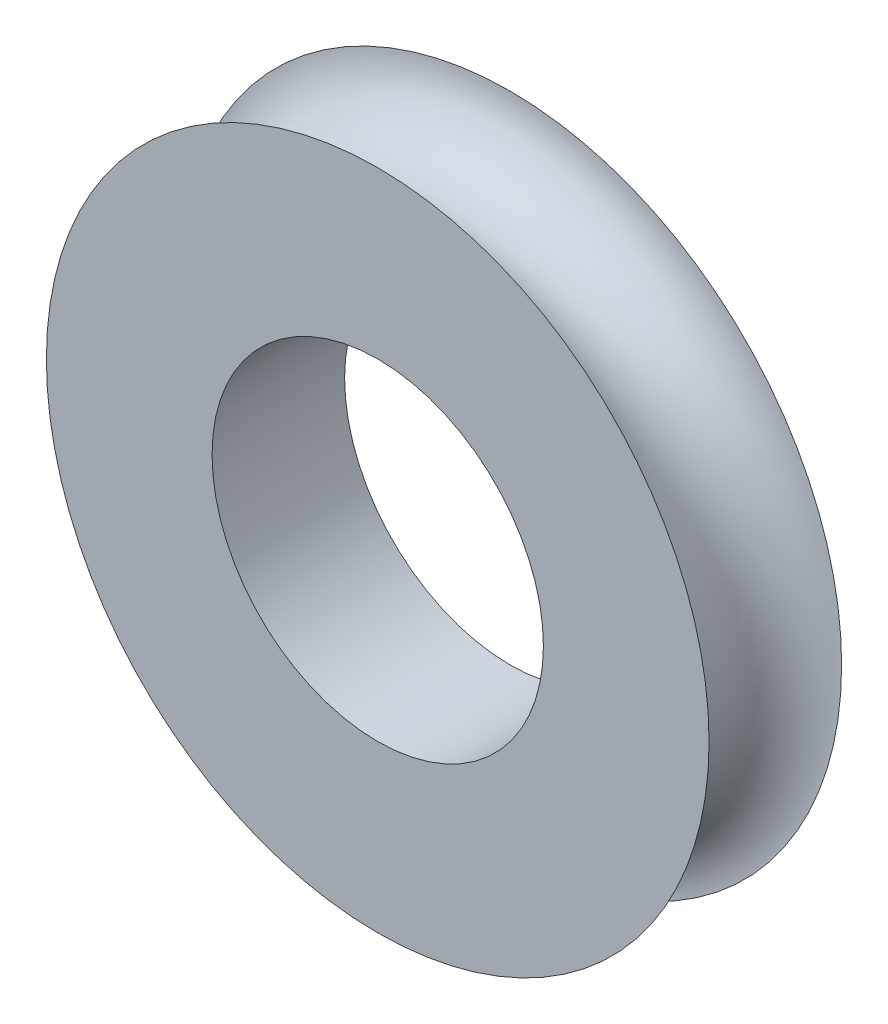
ISO-10303-21;
HEADER;
FILE_DESCRIPTION(('STEP AP214'),'2;1');
FILE_NAME('part.step','',(''),(''),'','','');
FILE_SCHEMA(('AUTOMOTIVE_DESIGN { 1 0 10303 214 1 1 1 1 }'));
ENDSEC;
DATA;
#1=APPLICATION_CONTEXT('core data for automotive mechanical design processes');
#2=APPLICATION_PROTOCOL_DEFINITION('international standard','automotive_design',2000,#1);
#3=PRODUCT_CONTEXT('',#1,'mechanical');
#4=PRODUCT('Part','Part','',(#3));
#5=PRODUCT_RELATED_PRODUCT_CATEGORY('part','',(#4));
#6=PRODUCT_DEFINITION_FORMATION('','',#4);
#7=PRODUCT_DEFINITION_CONTEXT('part definition',#1,'design');
#8=PRODUCT_DEFINITION('design','',#6,#7);
#9=PRODUCT_DEFINITION_SHAPE('','',#8);
#10=(LENGTH_UNIT() NAMED_UNIT(*) SI_UNIT(.MILLI.,.METRE.));
#11=(NAMED_UNIT(*) PLANE_ANGLE_UNIT() SI_UNIT($,.RADIAN.));
#12=(NAMED_UNIT(*) SI_UNIT($,.STERADIAN.) SOLID_ANGLE_UNIT());
#13=UNCERTAINTY_MEASURE_WITH_UNIT(LENGTH_MEASURE(1.E-05),#10,'distance_accuracy_value','');
#14=(GEOMETRIC_REPRESENTATION_CONTEXT(3) GLOBAL_UNCERTAINTY_ASSIGNED_CONTEXT((#13)) GLOBAL_UNIT_ASSIGNED_CONTEXT((#10,
#11,#12)) REPRESENTATION_CONTEXT('',''));
#15=CARTESIAN_POINT('',(0.,0.,0.));
#16=DIRECTION('',(0.,0.,1.));
#17=DIRECTION('',(1.,0.,0.));
#18=AXIS2_PLACEMENT_3D('',#15,#16,#17);
#19=CARTESIAN_POINT('',(0.,0.,2.));
#20=DIRECTION('',(0.,0.,1.));
#21=DIRECTION('',(1.,0.,0.));
#22=AXIS2_PLACEMENT_3D('',#19,#20,#21);
#23=PLANE('',#22);
#24=CARTESIAN_POINT('',(0.,0.,2.));
#25=DIRECTION('',(0.,0.,1.));
#26=DIRECTION('',(1.,0.,0.));
#27=AXIS2_PLACEMENT_3D('',#24,#25,#26);
#28=CIRCLE('',#27,5.);
#29=CARTESIAN_POINT('',(5.,0.,2.));
#30=VERTEX_POINT('',#29);
#31=EDGE_CURVE('E48',#30,#30,#28,.T.);
#32=ORIENTED_EDGE('',*,*,#31,.T.);
#33=EDGE_LOOP('',(#32));
#34=FACE_BOUND('',#33,.T.);
#35=CARTESIAN_POINT('',(0.,0.,2.));
#36=DIRECTION('',(0.,0.,1.));
#37=DIRECTION('',(1.,0.,0.));
#38=AXIS2_PLACEMENT_3D('',#35,#36,#37);
#39=CIRCLE('',#38,2.5);
#40=CARTESIAN_POINT('',(2.5,0.,2.));
#41=VERTEX_POINT('',#40);
#42=EDGE_CURVE('E10',#41,#41,#39,.T.);
#43=ORIENTED_EDGE('',*,*,#42,.F.);
#44=EDGE_LOOP('',(#43));
#45=FACE_BOUND('',#44,.T.);
#46=ADVANCED_FACE('F33',(#34,#45),#23,.T.);
#47=CARTESIAN_POINT('',(0.,0.,0.));
#48=DIRECTION('',(0.,0.,1.));
#49=DIRECTION('',(1.,0.,0.));
#50=AXIS2_PLACEMENT_3D('',#47,#48,#49);
#51=PLANE('',#50);
#52=CARTESIAN_POINT('',(0.,0.,0.));
#53=DIRECTION('',(0.,0.,1.));
#54=DIRECTION('',(1.,0.,0.));
#55=AXIS2_PLACEMENT_3D('',#52,#53,#54);
#56=CIRCLE('',#55,5.);
#57=CARTESIAN_POINT('',(5.,0.,0.));
#58=VERTEX_POINT('',#57);
#59=EDGE_CURVE('E44',#58,#58,#56,.T.);
#60=ORIENTED_EDGE('',*,*,#59,.F.);
#61=EDGE_LOOP('',(#60));
#62=FACE_BOUND('',#61,.T.);
#63=CARTESIAN_POINT('',(0.,0.,0.));
#64=DIRECTION('',(0.,0.,1.));
#65=DIRECTION('',(1.,0.,0.));
#66=AXIS2_PLACEMENT_3D('',#63,#64,#65);
#67=CIRCLE('',#66,2.5);
#68=CARTESIAN_POINT('',(2.5,0.,0.));
#69=VERTEX_POINT('',#68);
#70=EDGE_CURVE('E37',#69,#69,#67,.T.);
#71=ORIENTED_EDGE('',*,*,#70,.T.);
#72=EDGE_LOOP('',(#71));
#73=FACE_BOUND('',#72,.T.);
#74=ADVANCED_FACE('F35',(#62,#73),#51,.F.);
#75=CARTESIAN_POINT('',(0.,0.,2.));
#76=DIRECTION('',(0.,0.,-1.));
#77=DIRECTION('',(-1.,0.,0.));
#78=AXIS2_PLACEMENT_3D('',#75,#76,#77);
#79=CYLINDRICAL_SURFACE('',#78,2.5);
#80=ORIENTED_EDGE('',*,*,#42,.T.);
#81=EDGE_LOOP('',(#80));
#82=FACE_BOUND('',#81,.T.);
#83=ORIENTED_EDGE('',*,*,#70,.F.);
#84=EDGE_LOOP('',(#83));
#85=FACE_BOUND('',#84,.T.);
#86=ADVANCED_FACE('F56',(#82,#85),#79,.F.);
#87=CARTESIAN_POINT('',(0.,0.,1.));
#88=DIRECTION('',(0.,0.,1.));
#89=DIRECTION('',(1.,0.,0.));
#90=AXIS2_PLACEMENT_3D('',#87,#88,#89);
#91=TOROIDAL_SURFACE('',#90,5.,1.);
#92=ORIENTED_EDGE('',*,*,#59,.T.);
#93=EDGE_LOOP('',(#92));
#94=FACE_BOUND('',#93,.T.);
#95=ORIENTED_EDGE('',*,*,#31,.F.);
#96=EDGE_LOOP('',(#95));
#97=FACE_BOUND('',#96,.T.);
#98=ADVANCED_FACE('F54',(#94,#97),#91,.F.);
#99=CLOSED_SHELL('',(#46,#74,#86,#98));
#100=MANIFOLD_SOLID_BREP('B2',#99);
#101=ADVANCED_BREP_SHAPE_REPRESENTATION('',(#18,#100),#14);
#102=SHAPE_DEFINITION_REPRESENTATION(#9,#101);
ENDSEC;
END-ISO-10303-21;
